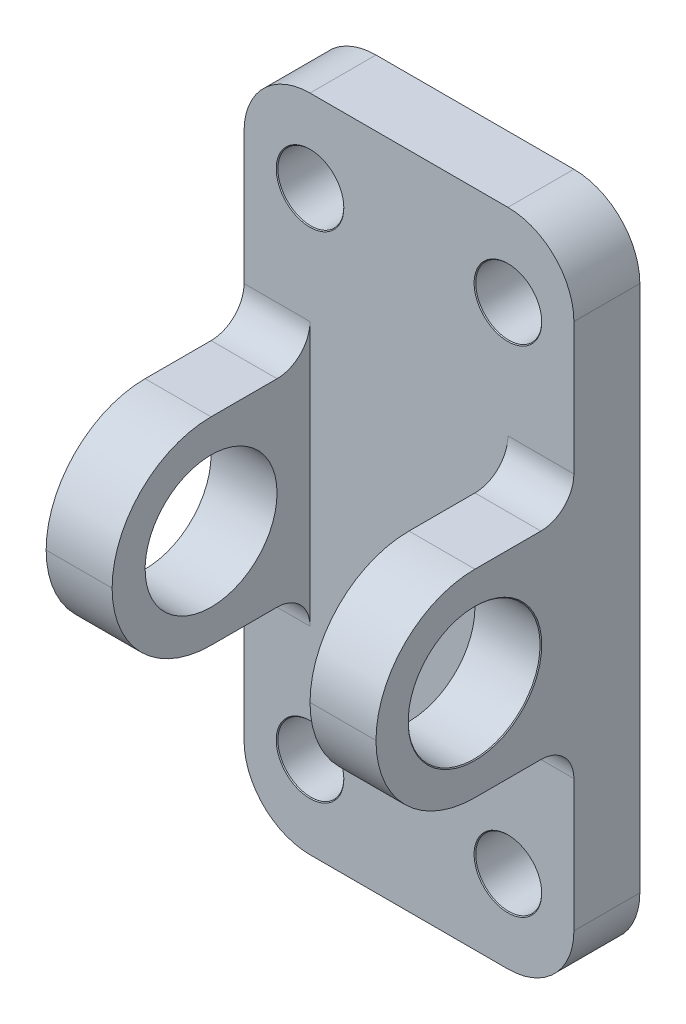
ISO-10303-21;
HEADER;
FILE_DESCRIPTION(('STEP AP214'),'2;1');
FILE_NAME('part.step','',(''),(''),'','','');
FILE_SCHEMA(('AUTOMOTIVE_DESIGN { 1 0 10303 214 1 1 1 1 }'));
ENDSEC;
DATA;
#1=APPLICATION_CONTEXT('core data for automotive mechanical design processes');
#2=APPLICATION_PROTOCOL_DEFINITION('international standard','automotive_design',2000,#1);
#3=PRODUCT_CONTEXT('',#1,'mechanical');
#4=PRODUCT('Part','Part','',(#3));
#5=PRODUCT_RELATED_PRODUCT_CATEGORY('part','',(#4));
#6=PRODUCT_DEFINITION_FORMATION('','',#4);
#7=PRODUCT_DEFINITION_CONTEXT('part definition',#1,'design');
#8=PRODUCT_DEFINITION('design','',#6,#7);
#9=PRODUCT_DEFINITION_SHAPE('','',#8);
#10=(LENGTH_UNIT() NAMED_UNIT(*) SI_UNIT(.MILLI.,.METRE.));
#11=(NAMED_UNIT(*) PLANE_ANGLE_UNIT() SI_UNIT($,.RADIAN.));
#12=(NAMED_UNIT(*) SI_UNIT($,.STERADIAN.) SOLID_ANGLE_UNIT());
#13=UNCERTAINTY_MEASURE_WITH_UNIT(LENGTH_MEASURE(1.E-05),#10,'distance_accuracy_value','');
#14=(GEOMETRIC_REPRESENTATION_CONTEXT(3) GLOBAL_UNCERTAINTY_ASSIGNED_CONTEXT((#13)) GLOBAL_UNIT_ASSIGNED_CONTEXT((#10,
#11,#12)) REPRESENTATION_CONTEXT('',''));
#15=CARTESIAN_POINT('',(0.,0.,0.));
#16=DIRECTION('',(0.,0.,1.));
#17=DIRECTION('',(1.,0.,0.));
#18=AXIS2_PLACEMENT_3D('',#15,#16,#17);
#19=CARTESIAN_POINT('',(0.,0.,0.));
#20=DIRECTION('',(0.,0.,1.));
#21=DIRECTION('',(1.,0.,0.));
#22=AXIS2_PLACEMENT_3D('',#19,#20,#21);
#23=PLANE('',#22);
#24=CARTESIAN_POINT('',(-3.,-7.5,0.));
#25=DIRECTION('',(0.,0.,1.));
#26=DIRECTION('',(1.,0.,0.));
#27=AXIS2_PLACEMENT_3D('',#24,#25,#26);
#28=CIRCLE('',#27,1.025);
#29=CARTESIAN_POINT('',(-1.975,-7.5,0.));
#30=VERTEX_POINT('',#29);
#31=EDGE_CURVE('E430',#30,#30,#28,.T.);
#32=ORIENTED_EDGE('',*,*,#31,.F.);
#33=EDGE_LOOP('',(#32));
#34=FACE_BOUND('',#33,.T.);
#35=CARTESIAN_POINT('',(3.,-7.5,0.));
#36=DIRECTION('',(0.,0.,1.));
#37=DIRECTION('',(1.,0.,0.));
#38=AXIS2_PLACEMENT_3D('',#35,#36,#37);
#39=CIRCLE('',#38,1.025);
#40=CARTESIAN_POINT('',(4.025,-7.5,0.));
#41=VERTEX_POINT('',#40);
#42=EDGE_CURVE('E417',#41,#41,#39,.T.);
#43=ORIENTED_EDGE('',*,*,#42,.F.);
#44=EDGE_LOOP('',(#43));
#45=FACE_BOUND('',#44,.T.);
#46=CARTESIAN_POINT('',(-3.,7.5,0.));
#47=DIRECTION('',(0.,0.,1.));
#48=DIRECTION('',(1.,0.,0.));
#49=AXIS2_PLACEMENT_3D('',#46,#47,#48);
#50=CIRCLE('',#49,1.025);
#51=CARTESIAN_POINT('',(-1.975,7.5,0.));
#52=VERTEX_POINT('',#51);
#53=EDGE_CURVE('E408',#52,#52,#50,.T.);
#54=ORIENTED_EDGE('',*,*,#53,.F.);
#55=EDGE_LOOP('',(#54));
#56=FACE_BOUND('',#55,.T.);
#57=CARTESIAN_POINT('',(3.,7.5,0.));
#58=DIRECTION('',(0.,0.,1.));
#59=DIRECTION('',(1.,0.,0.));
#60=AXIS2_PLACEMENT_3D('',#57,#58,#59);
#61=CIRCLE('',#60,1.025);
#62=CARTESIAN_POINT('',(4.025,7.5,0.));
#63=VERTEX_POINT('',#62);
#64=EDGE_CURVE('E399',#63,#63,#61,.T.);
#65=ORIENTED_EDGE('',*,*,#64,.F.);
#66=EDGE_LOOP('',(#65));
#67=FACE_BOUND('',#66,.T.);
#68=DIRECTION('',(-1.,0.,0.));
#69=VECTOR('',#68,1.);
#70=CARTESIAN_POINT('',(-5.,10.,0.));
#71=LINE('',#70,#69);
#72=CARTESIAN_POINT('',(3.,10.,0.));
#73=VERTEX_POINT('',#72);
#74=CARTESIAN_POINT('',(-3.,10.,0.));
#75=VERTEX_POINT('',#74);
#76=EDGE_CURVE('E355',#73,#75,#71,.T.);
#77=ORIENTED_EDGE('',*,*,#76,.T.);
#78=CARTESIAN_POINT('',(-3.,8.,0.));
#79=DIRECTION('',(0.,0.,1.));
#80=DIRECTION('',(1.,0.,0.));
#81=AXIS2_PLACEMENT_3D('',#78,#79,#80);
#82=CIRCLE('',#81,2.);
#83=CARTESIAN_POINT('',(-5.,8.,0.));
#84=VERTEX_POINT('',#83);
#85=EDGE_CURVE('E310',#75,#84,#82,.T.);
#86=ORIENTED_EDGE('',*,*,#85,.T.);
#87=DIRECTION('',(0.,-1.,0.));
#88=VECTOR('',#87,1.);
#89=CARTESIAN_POINT('',(-5.,-10.,0.));
#90=LINE('',#89,#88);
#91=CARTESIAN_POINT('',(-5.,4.,0.));
#92=VERTEX_POINT('',#91);
#93=EDGE_CURVE('E226',#84,#92,#90,.T.);
#94=ORIENTED_EDGE('',*,*,#93,.T.);
#95=DIRECTION('',(1.,0.,0.));
#96=VECTOR('',#95,1.);
#97=CARTESIAN_POINT('',(-3.,4.,0.));
#98=LINE('',#97,#96);
#99=CARTESIAN_POINT('',(-3.,4.,0.));
#100=VERTEX_POINT('',#99);
#101=EDGE_CURVE('E265',#92,#100,#98,.T.);
#102=ORIENTED_EDGE('',*,*,#101,.T.);
#103=DIRECTION('',(0.,1.,0.));
#104=VECTOR('',#103,1.);
#105=CARTESIAN_POINT('',(-3.,0.,0.));
#106=LINE('',#105,#104);
#107=CARTESIAN_POINT('',(-3.,-4.,0.));
#108=VERTEX_POINT('',#107);
#109=EDGE_CURVE('E366',#108,#100,#106,.T.);
#110=ORIENTED_EDGE('',*,*,#109,.F.);
#111=DIRECTION('',(1.,0.,0.));
#112=VECTOR('',#111,1.);
#113=CARTESIAN_POINT('',(0.,-4.,0.));
#114=LINE('',#113,#112);
#115=CARTESIAN_POINT('',(-5.,-4.,0.));
#116=VERTEX_POINT('',#115);
#117=EDGE_CURVE('E257',#108,#116,#114,.F.);
#118=ORIENTED_EDGE('',*,*,#117,.T.);
#119=CARTESIAN_POINT('',(-5.,-8.,0.));
#120=VERTEX_POINT('',#119);
#121=EDGE_CURVE('E350',#116,#120,#90,.T.);
#122=ORIENTED_EDGE('',*,*,#121,.T.);
#123=CARTESIAN_POINT('',(-3.,-8.,0.));
#124=DIRECTION('',(0.,0.,1.));
#125=DIRECTION('',(1.,0.,0.));
#126=AXIS2_PLACEMENT_3D('',#123,#124,#125);
#127=CIRCLE('',#126,2.);
#128=CARTESIAN_POINT('',(-3.,-10.,0.));
#129=VERTEX_POINT('',#128);
#130=EDGE_CURVE('E301',#120,#129,#127,.T.);
#131=ORIENTED_EDGE('',*,*,#130,.T.);
#132=DIRECTION('',(1.,0.,0.));
#133=VECTOR('',#132,1.);
#134=CARTESIAN_POINT('',(-5.,-10.,0.));
#135=LINE('',#134,#133);
#136=CARTESIAN_POINT('',(3.,-10.,0.));
#137=VERTEX_POINT('',#136);
#138=EDGE_CURVE('E332',#129,#137,#135,.T.);
#139=ORIENTED_EDGE('',*,*,#138,.T.);
#140=CARTESIAN_POINT('',(3.,-8.,0.));
#141=DIRECTION('',(0.,0.,1.));
#142=DIRECTION('',(1.,0.,0.));
#143=AXIS2_PLACEMENT_3D('',#140,#141,#142);
#144=CIRCLE('',#143,2.);
#145=CARTESIAN_POINT('',(5.,-8.,0.));
#146=VERTEX_POINT('',#145);
#147=EDGE_CURVE('E303',#137,#146,#144,.T.);
#148=ORIENTED_EDGE('',*,*,#147,.T.);
#149=DIRECTION('',(0.,1.,0.));
#150=VECTOR('',#149,1.);
#151=CARTESIAN_POINT('',(5.,-10.,0.));
#152=LINE('',#151,#150);
#153=CARTESIAN_POINT('',(5.,-4.,0.));
#154=VERTEX_POINT('',#153);
#155=EDGE_CURVE('E352',#146,#154,#152,.T.);
#156=ORIENTED_EDGE('',*,*,#155,.T.);
#157=DIRECTION('',(1.,0.,0.));
#158=VECTOR('',#157,1.);
#159=CARTESIAN_POINT('',(0.,-4.,0.));
#160=LINE('',#159,#158);
#161=CARTESIAN_POINT('',(3.,-4.,0.));
#162=VERTEX_POINT('',#161);
#163=EDGE_CURVE('E250',#154,#162,#160,.F.);
#164=ORIENTED_EDGE('',*,*,#163,.T.);
#165=DIRECTION('',(0.,1.,0.));
#166=VECTOR('',#165,1.);
#167=CARTESIAN_POINT('',(3.,0.,0.));
#168=LINE('',#167,#166);
#169=CARTESIAN_POINT('',(3.,4.,0.));
#170=VERTEX_POINT('',#169);
#171=EDGE_CURVE('E218',#162,#170,#168,.T.);
#172=ORIENTED_EDGE('',*,*,#171,.T.);
#173=DIRECTION('',(1.,0.,0.));
#174=VECTOR('',#173,1.);
#175=CARTESIAN_POINT('',(5.,4.,0.));
#176=LINE('',#175,#174);
#177=CARTESIAN_POINT('',(5.,4.,0.));
#178=VERTEX_POINT('',#177);
#179=EDGE_CURVE('E264',#170,#178,#176,.T.);
#180=ORIENTED_EDGE('',*,*,#179,.T.);
#181=CARTESIAN_POINT('',(5.,8.,0.));
#182=VERTEX_POINT('',#181);
#183=EDGE_CURVE('E354',#178,#182,#152,.T.);
#184=ORIENTED_EDGE('',*,*,#183,.T.);
#185=CARTESIAN_POINT('',(3.,8.,0.));
#186=DIRECTION('',(0.,0.,1.));
#187=DIRECTION('',(1.,0.,0.));
#188=AXIS2_PLACEMENT_3D('',#185,#186,#187);
#189=CIRCLE('',#188,2.);
#190=EDGE_CURVE('E304',#182,#73,#189,.T.);
#191=ORIENTED_EDGE('',*,*,#190,.T.);
#192=EDGE_LOOP('',(#77,#86,#94,#102,#110,#118,#122,#131,#139,#148,#156,#164,#172,#180,#184,#191));
#193=FACE_BOUND('',#192,.T.);
#194=ADVANCED_FACE('F41',(#34,#45,#56,#67,#193),#23,.T.);
#195=CARTESIAN_POINT('',(-5.,-10.,-2.));
#196=DIRECTION('',(0.,-1.,0.));
#197=DIRECTION('',(0.,0.,-1.));
#198=AXIS2_PLACEMENT_3D('',#195,#196,#197);
#199=PLANE('',#198);
#200=DIRECTION('',(1.,0.,0.));
#201=VECTOR('',#200,1.);
#202=CARTESIAN_POINT('',(-5.,-10.,-2.));
#203=LINE('',#202,#201);
#204=CARTESIAN_POINT('',(-3.,-10.,-2.));
#205=VERTEX_POINT('',#204);
#206=CARTESIAN_POINT('',(3.,-10.,-2.));
#207=VERTEX_POINT('',#206);
#208=EDGE_CURVE('E329',#205,#207,#203,.T.);
#209=ORIENTED_EDGE('',*,*,#208,.T.);
#210=DIRECTION('',(0.,0.,1.));
#211=VECTOR('',#210,1.);
#212=CARTESIAN_POINT('',(3.,-10.,-2.));
#213=LINE('',#212,#211);
#214=EDGE_CURVE('E11',#207,#137,#213,.T.);
#215=ORIENTED_EDGE('',*,*,#214,.T.);
#216=ORIENTED_EDGE('',*,*,#138,.F.);
#217=DIRECTION('',(0.,0.,1.));
#218=VECTOR('',#217,1.);
#219=CARTESIAN_POINT('',(-3.,-10.,-2.));
#220=LINE('',#219,#218);
#221=EDGE_CURVE('E47',#129,#205,#220,.F.);
#222=ORIENTED_EDGE('',*,*,#221,.T.);
#223=EDGE_LOOP('',(#209,#215,#216,#222));
#224=FACE_BOUND('',#223,.T.);
#225=ADVANCED_FACE('F327',(#224),#199,.T.);
#226=CARTESIAN_POINT('',(-5.,-10.,-2.));
#227=DIRECTION('',(-1.,0.,0.));
#228=DIRECTION('',(0.,-1.,0.));
#229=AXIS2_PLACEMENT_3D('',#226,#227,#228);
#230=PLANE('',#229);
#231=CARTESIAN_POINT('',(-5.,0.,3.));
#232=DIRECTION('',(1.,0.,0.));
#233=DIRECTION('',(0.,0.,-1.));
#234=AXIS2_PLACEMENT_3D('',#231,#232,#233);
#235=CIRCLE('',#234,2.);
#236=CARTESIAN_POINT('',(-5.,0.,1.));
#237=VERTEX_POINT('',#236);
#238=EDGE_CURVE('E256',#237,#237,#235,.T.);
#239=ORIENTED_EDGE('',*,*,#238,.T.);
#240=EDGE_LOOP('',(#239));
#241=FACE_BOUND('',#240,.T.);
#242=ORIENTED_EDGE('',*,*,#93,.F.);
#243=DIRECTION('',(0.,0.,1.));
#244=VECTOR('',#243,1.);
#245=CARTESIAN_POINT('',(-5.,8.,-2.));
#246=LINE('',#245,#244);
#247=CARTESIAN_POINT('',(-5.,8.,-2.));
#248=VERTEX_POINT('',#247);
#249=EDGE_CURVE('E315',#84,#248,#246,.F.);
#250=ORIENTED_EDGE('',*,*,#249,.T.);
#251=DIRECTION('',(0.,-1.,0.));
#252=VECTOR('',#251,1.);
#253=CARTESIAN_POINT('',(-5.,-10.,-2.));
#254=LINE('',#253,#252);
#255=CARTESIAN_POINT('',(-5.,-8.,-2.));
#256=VERTEX_POINT('',#255);
#257=EDGE_CURVE('E221',#248,#256,#254,.T.);
#258=ORIENTED_EDGE('',*,*,#257,.T.);
#259=DIRECTION('',(0.,0.,1.));
#260=VECTOR('',#259,1.);
#261=CARTESIAN_POINT('',(-5.,-8.,-2.));
#262=LINE('',#261,#260);
#263=EDGE_CURVE('E307',#256,#120,#262,.T.);
#264=ORIENTED_EDGE('',*,*,#263,.T.);
#265=ORIENTED_EDGE('',*,*,#121,.F.);
#266=CARTESIAN_POINT('',(-5.,-4.,1.));
#267=DIRECTION('',(-1.,0.,0.));
#268=DIRECTION('',(0.,-1.,0.));
#269=AXIS2_PLACEMENT_3D('',#266,#267,#268);
#270=CIRCLE('',#269,1.);
#271=CARTESIAN_POINT('',(-5.,-3.,1.));
#272=VERTEX_POINT('',#271);
#273=EDGE_CURVE('E288',#116,#272,#270,.F.);
#274=ORIENTED_EDGE('',*,*,#273,.T.);
#275=DIRECTION('',(0.,0.,-1.));
#276=VECTOR('',#275,1.);
#277=CARTESIAN_POINT('',(-5.,-3.,6.));
#278=LINE('',#277,#276);
#279=CARTESIAN_POINT('',(-5.,-3.,3.));
#280=VERTEX_POINT('',#279);
#281=EDGE_CURVE('E379',#280,#272,#278,.T.);
#282=ORIENTED_EDGE('',*,*,#281,.F.);
#283=CARTESIAN_POINT('',(-5.,0.,3.));
#284=DIRECTION('',(-1.,0.,0.));
#285=DIRECTION('',(0.,-1.,0.));
#286=AXIS2_PLACEMENT_3D('',#283,#284,#285);
#287=CIRCLE('',#286,3.);
#288=CARTESIAN_POINT('',(-5.,0.,6.));
#289=VERTEX_POINT('',#288);
#290=EDGE_CURVE('E241',#280,#289,#287,.T.);
#291=ORIENTED_EDGE('',*,*,#290,.T.);
#292=CARTESIAN_POINT('',(-5.,0.,3.));
#293=DIRECTION('',(-1.,0.,0.));
#294=DIRECTION('',(0.,-1.,0.));
#295=AXIS2_PLACEMENT_3D('',#292,#293,#294);
#296=CIRCLE('',#295,3.);
#297=CARTESIAN_POINT('',(-5.,3.,3.));
#298=VERTEX_POINT('',#297);
#299=EDGE_CURVE('E243',#289,#298,#296,.T.);
#300=ORIENTED_EDGE('',*,*,#299,.T.);
#301=DIRECTION('',(0.,0.,-1.));
#302=VECTOR('',#301,1.);
#303=CARTESIAN_POINT('',(-5.,3.,6.));
#304=LINE('',#303,#302);
#305=CARTESIAN_POINT('',(-5.,3.,1.));
#306=VERTEX_POINT('',#305);
#307=EDGE_CURVE('E380',#298,#306,#304,.T.);
#308=ORIENTED_EDGE('',*,*,#307,.T.);
#309=CARTESIAN_POINT('',(-5.,4.,1.));
#310=DIRECTION('',(-1.,0.,0.));
#311=DIRECTION('',(0.,-1.,0.));
#312=AXIS2_PLACEMENT_3D('',#309,#310,#311);
#313=CIRCLE('',#312,1.);
#314=EDGE_CURVE('E281',#306,#92,#313,.F.);
#315=ORIENTED_EDGE('',*,*,#314,.T.);
#316=EDGE_LOOP('',(#242,#250,#258,#264,#265,#274,#282,#291,#300,#308,#315));
#317=FACE_BOUND('',#316,.T.);
#318=ADVANCED_FACE('F348',(#241,#317),#230,.T.);
#319=CARTESIAN_POINT('',(-5.,10.,-2.));
#320=DIRECTION('',(0.,1.,0.));
#321=DIRECTION('',(0.,0.,1.));
#322=AXIS2_PLACEMENT_3D('',#319,#320,#321);
#323=PLANE('',#322);
#324=DIRECTION('',(-1.,0.,0.));
#325=VECTOR('',#324,1.);
#326=CARTESIAN_POINT('',(-5.,10.,-2.));
#327=LINE('',#326,#325);
#328=CARTESIAN_POINT('',(3.,10.,-2.));
#329=VERTEX_POINT('',#328);
#330=CARTESIAN_POINT('',(-3.,10.,-2.));
#331=VERTEX_POINT('',#330);
#332=EDGE_CURVE('E224',#329,#331,#327,.T.);
#333=ORIENTED_EDGE('',*,*,#332,.T.);
#334=DIRECTION('',(0.,0.,1.));
#335=VECTOR('',#334,1.);
#336=CARTESIAN_POINT('',(-3.,10.,-2.));
#337=LINE('',#336,#335);
#338=EDGE_CURVE('E296',#331,#75,#337,.T.);
#339=ORIENTED_EDGE('',*,*,#338,.T.);
#340=ORIENTED_EDGE('',*,*,#76,.F.);
#341=DIRECTION('',(0.,0.,1.));
#342=VECTOR('',#341,1.);
#343=CARTESIAN_POINT('',(3.,10.,-2.));
#344=LINE('',#343,#342);
#345=EDGE_CURVE('E298',#73,#329,#344,.F.);
#346=ORIENTED_EDGE('',*,*,#345,.T.);
#347=EDGE_LOOP('',(#333,#339,#340,#346));
#348=FACE_BOUND('',#347,.T.);
#349=ADVANCED_FACE('F500',(#348),#323,.T.);
#350=CARTESIAN_POINT('',(5.,-10.,-2.));
#351=DIRECTION('',(1.,0.,0.));
#352=DIRECTION('',(0.,1.,0.));
#353=AXIS2_PLACEMENT_3D('',#350,#351,#352);
#354=PLANE('',#353);
#355=CARTESIAN_POINT('',(5.,0.,3.));
#356=DIRECTION('',(1.,0.,0.));
#357=DIRECTION('',(0.,0.,-1.));
#358=AXIS2_PLACEMENT_3D('',#355,#356,#357);
#359=CIRCLE('',#358,2.025);
#360=CARTESIAN_POINT('',(5.,0.,0.975));
#361=VERTEX_POINT('',#360);
#362=EDGE_CURVE('E393',#361,#361,#359,.T.);
#363=ORIENTED_EDGE('',*,*,#362,.F.);
#364=EDGE_LOOP('',(#363));
#365=FACE_BOUND('',#364,.T.);
#366=DIRECTION('',(0.,1.,0.));
#367=VECTOR('',#366,1.);
#368=CARTESIAN_POINT('',(5.,-10.,-2.));
#369=LINE('',#368,#367);
#370=CARTESIAN_POINT('',(5.,-8.,-2.));
#371=VERTEX_POINT('',#370);
#372=CARTESIAN_POINT('',(5.,8.,-2.));
#373=VERTEX_POINT('',#372);
#374=EDGE_CURVE('E339',#371,#373,#369,.T.);
#375=ORIENTED_EDGE('',*,*,#374,.T.);
#376=DIRECTION('',(0.,0.,1.));
#377=VECTOR('',#376,1.);
#378=CARTESIAN_POINT('',(5.,8.,-2.));
#379=LINE('',#378,#377);
#380=EDGE_CURVE('E321',#373,#182,#379,.T.);
#381=ORIENTED_EDGE('',*,*,#380,.T.);
#382=ORIENTED_EDGE('',*,*,#183,.F.);
#383=CARTESIAN_POINT('',(5.,4.,1.));
#384=DIRECTION('',(1.,0.,0.));
#385=DIRECTION('',(0.,1.,0.));
#386=AXIS2_PLACEMENT_3D('',#383,#384,#385);
#387=CIRCLE('',#386,1.);
#388=CARTESIAN_POINT('',(4.99999999999999,3.,1.));
#389=VERTEX_POINT('',#388);
#390=EDGE_CURVE('E276',#178,#389,#387,.F.);
#391=ORIENTED_EDGE('',*,*,#390,.T.);
#392=DIRECTION('',(0.,0.,-1.));
#393=VECTOR('',#392,1.);
#394=CARTESIAN_POINT('',(4.99999999999999,3.,6.));
#395=LINE('',#394,#393);
#396=CARTESIAN_POINT('',(4.99999999999999,3.,3.));
#397=VERTEX_POINT('',#396);
#398=EDGE_CURVE('E212',#397,#389,#395,.T.);
#399=ORIENTED_EDGE('',*,*,#398,.F.);
#400=CARTESIAN_POINT('',(5.,0.,3.));
#401=DIRECTION('',(1.,0.,0.));
#402=DIRECTION('',(0.,1.,0.));
#403=AXIS2_PLACEMENT_3D('',#400,#401,#402);
#404=CIRCLE('',#403,3.);
#405=CARTESIAN_POINT('',(5.,0.,6.));
#406=VERTEX_POINT('',#405);
#407=EDGE_CURVE('E217',#397,#406,#404,.T.);
#408=ORIENTED_EDGE('',*,*,#407,.T.);
#409=CARTESIAN_POINT('',(5.,0.,3.));
#410=DIRECTION('',(1.,0.,0.));
#411=DIRECTION('',(0.,1.,0.));
#412=AXIS2_PLACEMENT_3D('',#409,#410,#411);
#413=CIRCLE('',#412,3.);
#414=CARTESIAN_POINT('',(5.,-3.,3.));
#415=VERTEX_POINT('',#414);
#416=EDGE_CURVE('E219',#406,#415,#413,.T.);
#417=ORIENTED_EDGE('',*,*,#416,.T.);
#418=DIRECTION('',(0.,0.,-1.));
#419=VECTOR('',#418,1.);
#420=CARTESIAN_POINT('',(5.,-3.,6.));
#421=LINE('',#420,#419);
#422=CARTESIAN_POINT('',(5.,-3.,1.));
#423=VERTEX_POINT('',#422);
#424=EDGE_CURVE('E370',#415,#423,#421,.T.);
#425=ORIENTED_EDGE('',*,*,#424,.T.);
#426=CARTESIAN_POINT('',(5.,-4.,1.));
#427=DIRECTION('',(1.,0.,0.));
#428=DIRECTION('',(0.,1.,0.));
#429=AXIS2_PLACEMENT_3D('',#426,#427,#428);
#430=CIRCLE('',#429,1.);
#431=EDGE_CURVE('E293',#423,#154,#430,.F.);
#432=ORIENTED_EDGE('',*,*,#431,.T.);
#433=ORIENTED_EDGE('',*,*,#155,.F.);
#434=DIRECTION('',(0.,0.,1.));
#435=VECTOR('',#434,1.);
#436=CARTESIAN_POINT('',(5.,-8.,-2.));
#437=LINE('',#436,#435);
#438=EDGE_CURVE('E65',#146,#371,#437,.F.);
#439=ORIENTED_EDGE('',*,*,#438,.T.);
#440=EDGE_LOOP('',(#375,#381,#382,#391,#399,#408,#417,#425,#432,#433,#439));
#441=FACE_BOUND('',#440,.T.);
#442=ADVANCED_FACE('F495',(#365,#441),#354,.T.);
#443=CARTESIAN_POINT('',(0.,0.,-2.));
#444=DIRECTION('',(0.,0.,1.));
#445=DIRECTION('',(1.,0.,0.));
#446=AXIS2_PLACEMENT_3D('',#443,#444,#445);
#447=PLANE('',#446);
#448=CARTESIAN_POINT('',(-3.,-7.5,-2.));
#449=DIRECTION('',(0.,0.,1.));
#450=DIRECTION('',(1.,0.,0.));
#451=AXIS2_PLACEMENT_3D('',#448,#449,#450);
#452=CIRCLE('',#451,1.);
#453=CARTESIAN_POINT('',(-2.,-7.5,-2.));
#454=VERTEX_POINT('',#453);
#455=EDGE_CURVE('E423',#454,#454,#452,.T.);
#456=ORIENTED_EDGE('',*,*,#455,.T.);
#457=EDGE_LOOP('',(#456));
#458=FACE_BOUND('',#457,.T.);
#459=CARTESIAN_POINT('',(3.,-7.5,-2.));
#460=DIRECTION('',(0.,0.,1.));
#461=DIRECTION('',(1.,0.,0.));
#462=AXIS2_PLACEMENT_3D('',#459,#460,#461);
#463=CIRCLE('',#462,1.);
#464=CARTESIAN_POINT('',(4.,-7.5,-2.));
#465=VERTEX_POINT('',#464);
#466=EDGE_CURVE('E415',#465,#465,#463,.T.);
#467=ORIENTED_EDGE('',*,*,#466,.T.);
#468=EDGE_LOOP('',(#467));
#469=FACE_BOUND('',#468,.T.);
#470=CARTESIAN_POINT('',(-3.,7.5,-2.));
#471=DIRECTION('',(0.,0.,1.));
#472=DIRECTION('',(1.,0.,0.));
#473=AXIS2_PLACEMENT_3D('',#470,#471,#472);
#474=CIRCLE('',#473,1.);
#475=CARTESIAN_POINT('',(-2.,7.5,-2.));
#476=VERTEX_POINT('',#475);
#477=EDGE_CURVE('E401',#476,#476,#474,.T.);
#478=ORIENTED_EDGE('',*,*,#477,.T.);
#479=EDGE_LOOP('',(#478));
#480=FACE_BOUND('',#479,.T.);
#481=CARTESIAN_POINT('',(3.,7.5,-2.));
#482=DIRECTION('',(0.,0.,1.));
#483=DIRECTION('',(1.,0.,0.));
#484=AXIS2_PLACEMENT_3D('',#481,#482,#483);
#485=CIRCLE('',#484,1.);
#486=CARTESIAN_POINT('',(4.,7.5,-2.));
#487=VERTEX_POINT('',#486);
#488=EDGE_CURVE('E392',#487,#487,#485,.T.);
#489=ORIENTED_EDGE('',*,*,#488,.T.);
#490=EDGE_LOOP('',(#489));
#491=FACE_BOUND('',#490,.T.);
#492=ORIENTED_EDGE('',*,*,#257,.F.);
#493=CARTESIAN_POINT('',(-3.,8.,-2.));
#494=DIRECTION('',(0.,0.,1.));
#495=DIRECTION('',(1.,0.,0.));
#496=AXIS2_PLACEMENT_3D('',#493,#494,#495);
#497=CIRCLE('',#496,2.);
#498=EDGE_CURVE('E316',#248,#331,#497,.F.);
#499=ORIENTED_EDGE('',*,*,#498,.T.);
#500=ORIENTED_EDGE('',*,*,#332,.F.);
#501=CARTESIAN_POINT('',(3.,8.,-2.));
#502=DIRECTION('',(0.,0.,1.));
#503=DIRECTION('',(1.,0.,0.));
#504=AXIS2_PLACEMENT_3D('',#501,#502,#503);
#505=CIRCLE('',#504,2.);
#506=EDGE_CURVE('E57',#329,#373,#505,.F.);
#507=ORIENTED_EDGE('',*,*,#506,.T.);
#508=ORIENTED_EDGE('',*,*,#374,.F.);
#509=CARTESIAN_POINT('',(3.,-8.,-2.));
#510=DIRECTION('',(0.,0.,1.));
#511=DIRECTION('',(1.,0.,0.));
#512=AXIS2_PLACEMENT_3D('',#509,#510,#511);
#513=CIRCLE('',#512,2.);
#514=EDGE_CURVE('E317',#371,#207,#513,.F.);
#515=ORIENTED_EDGE('',*,*,#514,.T.);
#516=ORIENTED_EDGE('',*,*,#208,.F.);
#517=CARTESIAN_POINT('',(-3.,-8.,-2.));
#518=DIRECTION('',(0.,0.,1.));
#519=DIRECTION('',(1.,0.,0.));
#520=AXIS2_PLACEMENT_3D('',#517,#518,#519);
#521=CIRCLE('',#520,2.);
#522=EDGE_CURVE('E313',#205,#256,#521,.F.);
#523=ORIENTED_EDGE('',*,*,#522,.T.);
#524=EDGE_LOOP('',(#492,#499,#500,#507,#508,#515,#516,#523));
#525=FACE_BOUND('',#524,.T.);
#526=ADVANCED_FACE('F340',(#458,#469,#480,#491,#525),#447,.F.);
#527=CARTESIAN_POINT('',(3.,0.,6.));
#528=DIRECTION('',(-1.,0.,0.));
#529=DIRECTION('',(0.,-1.,0.));
#530=AXIS2_PLACEMENT_3D('',#527,#528,#529);
#531=PLANE('',#530);
#532=CARTESIAN_POINT('',(3.,0.,3.));
#533=DIRECTION('',(-1.,0.,0.));
#534=DIRECTION('',(0.,-1.,0.));
#535=AXIS2_PLACEMENT_3D('',#532,#533,#534);
#536=CIRCLE('',#535,2.);
#537=CARTESIAN_POINT('',(3.,-1.99999999999999,3.));
#538=VERTEX_POINT('',#537);
#539=EDGE_CURVE('E254',#538,#538,#536,.T.);
#540=ORIENTED_EDGE('',*,*,#539,.F.);
#541=EDGE_LOOP('',(#540));
#542=FACE_BOUND('',#541,.T.);
#543=CARTESIAN_POINT('',(3.,0.,3.));
#544=DIRECTION('',(-1.,0.,0.));
#545=DIRECTION('',(0.,-1.,0.));
#546=AXIS2_PLACEMENT_3D('',#543,#544,#545);
#547=CIRCLE('',#546,3.);
#548=CARTESIAN_POINT('',(3.,-3.,3.));
#549=VERTEX_POINT('',#548);
#550=CARTESIAN_POINT('',(3.,0.,6.));
#551=VERTEX_POINT('',#550);
#552=EDGE_CURVE('E199',#549,#551,#547,.T.);
#553=ORIENTED_EDGE('',*,*,#552,.T.);
#554=CARTESIAN_POINT('',(3.,0.,3.));
#555=DIRECTION('',(-1.,0.,0.));
#556=DIRECTION('',(0.,-1.,0.));
#557=AXIS2_PLACEMENT_3D('',#554,#555,#556);
#558=CIRCLE('',#557,3.);
#559=CARTESIAN_POINT('',(3.,3.,3.));
#560=VERTEX_POINT('',#559);
#561=EDGE_CURVE('E191',#551,#560,#558,.T.);
#562=ORIENTED_EDGE('',*,*,#561,.T.);
#563=DIRECTION('',(0.,0.,-1.));
#564=VECTOR('',#563,1.);
#565=CARTESIAN_POINT('',(3.,3.,6.));
#566=LINE('',#565,#564);
#567=CARTESIAN_POINT('',(3.,3.,1.));
#568=VERTEX_POINT('',#567);
#569=EDGE_CURVE('E198',#560,#568,#566,.T.);
#570=ORIENTED_EDGE('',*,*,#569,.T.);
#571=CARTESIAN_POINT('',(3.,4.,1.));
#572=DIRECTION('',(-1.,0.,0.));
#573=DIRECTION('',(0.,-1.,0.));
#574=AXIS2_PLACEMENT_3D('',#571,#572,#573);
#575=CIRCLE('',#574,1.);
#576=EDGE_CURVE('E278',#568,#170,#575,.F.);
#577=ORIENTED_EDGE('',*,*,#576,.T.);
#578=ORIENTED_EDGE('',*,*,#171,.F.);
#579=CARTESIAN_POINT('',(3.,-4.,1.));
#580=DIRECTION('',(-1.,0.,0.));
#581=DIRECTION('',(0.,-1.,0.));
#582=AXIS2_PLACEMENT_3D('',#579,#580,#581);
#583=CIRCLE('',#582,1.);
#584=CARTESIAN_POINT('',(3.,-3.,1.));
#585=VERTEX_POINT('',#584);
#586=EDGE_CURVE('E295',#162,#585,#583,.F.);
#587=ORIENTED_EDGE('',*,*,#586,.T.);
#588=DIRECTION('',(0.,0.,-1.));
#589=VECTOR('',#588,1.);
#590=CARTESIAN_POINT('',(3.,-3.,6.));
#591=LINE('',#590,#589);
#592=EDGE_CURVE('E361',#549,#585,#591,.T.);
#593=ORIENTED_EDGE('',*,*,#592,.F.);
#594=EDGE_LOOP('',(#553,#562,#570,#577,#578,#587,#593));
#595=FACE_BOUND('',#594,.T.);
#596=ADVANCED_FACE('F193',(#542,#595),#531,.T.);
#597=CARTESIAN_POINT('',(0.,-3.,6.));
#598=DIRECTION('',(0.,1.,0.));
#599=DIRECTION('',(-1.,0.,0.));
#600=AXIS2_PLACEMENT_3D('',#597,#598,#599);
#601=PLANE('',#600);
#602=ORIENTED_EDGE('',*,*,#592,.T.);
#603=DIRECTION('',(1.,0.,0.));
#604=VECTOR('',#603,1.);
#605=CARTESIAN_POINT('',(0.,-3.,1.));
#606=LINE('',#605,#604);
#607=EDGE_CURVE('E274',#585,#423,#606,.T.);
#608=ORIENTED_EDGE('',*,*,#607,.T.);
#609=ORIENTED_EDGE('',*,*,#424,.F.);
#610=DIRECTION('',(1.,0.,0.));
#611=VECTOR('',#610,1.);
#612=CARTESIAN_POINT('',(3.,-3.,3.));
#613=LINE('',#612,#611);
#614=EDGE_CURVE('E204',#415,#549,#613,.F.);
#615=ORIENTED_EDGE('',*,*,#614,.T.);
#616=EDGE_LOOP('',(#602,#608,#609,#615));
#617=FACE_BOUND('',#616,.T.);
#618=ADVANCED_FACE('F483',(#617),#601,.F.);
#619=CARTESIAN_POINT('',(0.,3.,6.));
#620=DIRECTION('',(0.,1.,0.));
#621=DIRECTION('',(-1.,0.,0.));
#622=AXIS2_PLACEMENT_3D('',#619,#620,#621);
#623=PLANE('',#622);
#624=ORIENTED_EDGE('',*,*,#398,.T.);
#625=DIRECTION('',(1.,0.,0.));
#626=VECTOR('',#625,1.);
#627=CARTESIAN_POINT('',(3.,3.,1.));
#628=LINE('',#627,#626);
#629=EDGE_CURVE('E213',#389,#568,#628,.F.);
#630=ORIENTED_EDGE('',*,*,#629,.T.);
#631=ORIENTED_EDGE('',*,*,#569,.F.);
#632=DIRECTION('',(1.,0.,0.));
#633=VECTOR('',#632,1.);
#634=CARTESIAN_POINT('',(0.,3.,3.));
#635=LINE('',#634,#633);
#636=EDGE_CURVE('E214',#560,#397,#635,.T.);
#637=ORIENTED_EDGE('',*,*,#636,.T.);
#638=EDGE_LOOP('',(#624,#630,#631,#637));
#639=FACE_BOUND('',#638,.T.);
#640=ADVANCED_FACE('F208',(#639),#623,.T.);
#641=CARTESIAN_POINT('',(0.,-3.,6.));
#642=DIRECTION('',(0.,1.,0.));
#643=DIRECTION('',(-1.,0.,0.));
#644=AXIS2_PLACEMENT_3D('',#641,#642,#643);
#645=PLANE('',#644);
#646=ORIENTED_EDGE('',*,*,#281,.T.);
#647=DIRECTION('',(1.,0.,0.));
#648=VECTOR('',#647,1.);
#649=CARTESIAN_POINT('',(0.,-3.,1.));
#650=LINE('',#649,#648);
#651=CARTESIAN_POINT('',(-3.,-3.,1.));
#652=VERTEX_POINT('',#651);
#653=EDGE_CURVE('E272',#272,#652,#650,.T.);
#654=ORIENTED_EDGE('',*,*,#653,.T.);
#655=DIRECTION('',(0.,0.,-1.));
#656=VECTOR('',#655,1.);
#657=CARTESIAN_POINT('',(-3.,-3.,6.));
#658=LINE('',#657,#656);
#659=CARTESIAN_POINT('',(-3.,-3.,3.));
#660=VERTEX_POINT('',#659);
#661=EDGE_CURVE('E356',#660,#652,#658,.T.);
#662=ORIENTED_EDGE('',*,*,#661,.F.);
#663=DIRECTION('',(1.,0.,0.));
#664=VECTOR('',#663,1.);
#665=CARTESIAN_POINT('',(-5.,-3.,3.));
#666=LINE('',#665,#664);
#667=EDGE_CURVE('E244',#660,#280,#666,.F.);
#668=ORIENTED_EDGE('',*,*,#667,.T.);
#669=EDGE_LOOP('',(#646,#654,#662,#668));
#670=FACE_BOUND('',#669,.T.);
#671=ADVANCED_FACE('F480',(#670),#645,.F.);
#672=CARTESIAN_POINT('',(-3.,0.,6.));
#673=DIRECTION('',(-1.,0.,0.));
#674=DIRECTION('',(0.,-1.,0.));
#675=AXIS2_PLACEMENT_3D('',#672,#673,#674);
#676=PLANE('',#675);
#677=CARTESIAN_POINT('',(-3.,0.,3.));
#678=DIRECTION('',(-1.,0.,0.));
#679=DIRECTION('',(0.,-1.,0.));
#680=AXIS2_PLACEMENT_3D('',#677,#678,#679);
#681=CIRCLE('',#680,2.);
#682=CARTESIAN_POINT('',(-3.,-1.99999999999999,3.));
#683=VERTEX_POINT('',#682);
#684=EDGE_CURVE('E251',#683,#683,#681,.T.);
#685=ORIENTED_EDGE('',*,*,#684,.T.);
#686=EDGE_LOOP('',(#685));
#687=FACE_BOUND('',#686,.T.);
#688=DIRECTION('',(0.,0.,-1.));
#689=VECTOR('',#688,1.);
#690=CARTESIAN_POINT('',(-3.,3.,6.));
#691=LINE('',#690,#689);
#692=CARTESIAN_POINT('',(-3.,3.,3.));
#693=VERTEX_POINT('',#692);
#694=CARTESIAN_POINT('',(-3.,3.,1.));
#695=VERTEX_POINT('',#694);
#696=EDGE_CURVE('E372',#693,#695,#691,.T.);
#697=ORIENTED_EDGE('',*,*,#696,.F.);
#698=CARTESIAN_POINT('',(-3.,0.,3.));
#699=DIRECTION('',(-1.,0.,0.));
#700=DIRECTION('',(0.,-1.,0.));
#701=AXIS2_PLACEMENT_3D('',#698,#699,#700);
#702=CIRCLE('',#701,3.);
#703=CARTESIAN_POINT('',(-3.,0.,6.));
#704=VERTEX_POINT('',#703);
#705=EDGE_CURVE('E237',#693,#704,#702,.F.);
#706=ORIENTED_EDGE('',*,*,#705,.T.);
#707=CARTESIAN_POINT('',(-3.,0.,3.));
#708=DIRECTION('',(-1.,0.,0.));
#709=DIRECTION('',(0.,-1.,0.));
#710=AXIS2_PLACEMENT_3D('',#707,#708,#709);
#711=CIRCLE('',#710,3.);
#712=EDGE_CURVE('E240',#704,#660,#711,.F.);
#713=ORIENTED_EDGE('',*,*,#712,.T.);
#714=ORIENTED_EDGE('',*,*,#661,.T.);
#715=CARTESIAN_POINT('',(-3.,-4.,1.));
#716=DIRECTION('',(-1.,0.,0.));
#717=DIRECTION('',(0.,-1.,0.));
#718=AXIS2_PLACEMENT_3D('',#715,#716,#717);
#719=CIRCLE('',#718,1.);
#720=EDGE_CURVE('E286',#652,#108,#719,.T.);
#721=ORIENTED_EDGE('',*,*,#720,.T.);
#722=ORIENTED_EDGE('',*,*,#109,.T.);
#723=CARTESIAN_POINT('',(-3.,4.,1.));
#724=DIRECTION('',(-1.,0.,0.));
#725=DIRECTION('',(0.,-1.,0.));
#726=AXIS2_PLACEMENT_3D('',#723,#724,#725);
#727=CIRCLE('',#726,1.);
#728=EDGE_CURVE('E283',#100,#695,#727,.T.);
#729=ORIENTED_EDGE('',*,*,#728,.T.);
#730=EDGE_LOOP('',(#697,#706,#713,#714,#721,#722,#729));
#731=FACE_BOUND('',#730,.T.);
#732=ADVANCED_FACE('F475',(#687,#731),#676,.F.);
#733=CARTESIAN_POINT('',(0.,3.,6.));
#734=DIRECTION('',(0.,1.,0.));
#735=DIRECTION('',(-1.,0.,0.));
#736=AXIS2_PLACEMENT_3D('',#733,#734,#735);
#737=PLANE('',#736);
#738=ORIENTED_EDGE('',*,*,#696,.T.);
#739=DIRECTION('',(1.,0.,0.));
#740=VECTOR('',#739,1.);
#741=CARTESIAN_POINT('',(-5.,3.,1.));
#742=LINE('',#741,#740);
#743=EDGE_CURVE('E268',#695,#306,#742,.F.);
#744=ORIENTED_EDGE('',*,*,#743,.T.);
#745=ORIENTED_EDGE('',*,*,#307,.F.);
#746=DIRECTION('',(1.,0.,0.));
#747=VECTOR('',#746,1.);
#748=CARTESIAN_POINT('',(0.,3.,3.));
#749=LINE('',#748,#747);
#750=EDGE_CURVE('E234',#298,#693,#749,.T.);
#751=ORIENTED_EDGE('',*,*,#750,.T.);
#752=EDGE_LOOP('',(#738,#744,#745,#751));
#753=FACE_BOUND('',#752,.T.);
#754=ADVANCED_FACE('F469',(#753),#737,.T.);
#755=CARTESIAN_POINT('',(0.,0.,3.));
#756=DIRECTION('',(-1.,0.,0.));
#757=DIRECTION('',(0.,-1.,0.));
#758=AXIS2_PLACEMENT_3D('',#755,#756,#757);
#759=CYLINDRICAL_SURFACE('',#758,3.);
#760=DIRECTION('',(1.,0.,0.));
#761=VECTOR('',#760,1.);
#762=CARTESIAN_POINT('',(5.,0.,6.));
#763=LINE('',#762,#761);
#764=EDGE_CURVE('E247',#551,#406,#763,.T.);
#765=ORIENTED_EDGE('',*,*,#764,.F.);
#766=ORIENTED_EDGE('',*,*,#552,.F.);
#767=ORIENTED_EDGE('',*,*,#614,.F.);
#768=ORIENTED_EDGE('',*,*,#416,.F.);
#769=EDGE_LOOP('',(#765,#766,#767,#768));
#770=FACE_BOUND('',#769,.T.);
#771=ADVANCED_FACE('F471',(#770),#759,.T.);
#772=CARTESIAN_POINT('',(0.,0.,3.));
#773=DIRECTION('',(1.,0.,0.));
#774=DIRECTION('',(0.,1.,0.));
#775=AXIS2_PLACEMENT_3D('',#772,#773,#774);
#776=CYLINDRICAL_SURFACE('',#775,3.);
#777=ORIENTED_EDGE('',*,*,#561,.F.);
#778=ORIENTED_EDGE('',*,*,#764,.T.);
#779=ORIENTED_EDGE('',*,*,#407,.F.);
#780=ORIENTED_EDGE('',*,*,#636,.F.);
#781=EDGE_LOOP('',(#777,#778,#779,#780));
#782=FACE_BOUND('',#781,.T.);
#783=ADVANCED_FACE('F216',(#782),#776,.T.);
#784=CARTESIAN_POINT('',(0.,0.,3.));
#785=DIRECTION('',(-1.,0.,0.));
#786=DIRECTION('',(0.,-1.,0.));
#787=AXIS2_PLACEMENT_3D('',#784,#785,#786);
#788=CYLINDRICAL_SURFACE('',#787,3.);
#789=DIRECTION('',(1.,0.,0.));
#790=VECTOR('',#789,1.);
#791=CARTESIAN_POINT('',(-3.,0.,6.));
#792=LINE('',#791,#790);
#793=EDGE_CURVE('E249',#289,#704,#792,.T.);
#794=ORIENTED_EDGE('',*,*,#793,.F.);
#795=ORIENTED_EDGE('',*,*,#290,.F.);
#796=ORIENTED_EDGE('',*,*,#667,.F.);
#797=ORIENTED_EDGE('',*,*,#712,.F.);
#798=EDGE_LOOP('',(#794,#795,#796,#797));
#799=FACE_BOUND('',#798,.T.);
#800=ADVANCED_FACE('F508',(#799),#788,.T.);
#801=CARTESIAN_POINT('',(0.,0.,3.));
#802=DIRECTION('',(1.,0.,0.));
#803=DIRECTION('',(0.,1.,0.));
#804=AXIS2_PLACEMENT_3D('',#801,#802,#803);
#805=CYLINDRICAL_SURFACE('',#804,3.);
#806=ORIENTED_EDGE('',*,*,#299,.F.);
#807=ORIENTED_EDGE('',*,*,#793,.T.);
#808=ORIENTED_EDGE('',*,*,#705,.F.);
#809=ORIENTED_EDGE('',*,*,#750,.F.);
#810=EDGE_LOOP('',(#806,#807,#808,#809));
#811=FACE_BOUND('',#810,.T.);
#812=ADVANCED_FACE('F514',(#811),#805,.T.);
#813=CARTESIAN_POINT('',(5.,0.,3.));
#814=DIRECTION('',(1.,0.,0.));
#815=DIRECTION('',(0.,0.,-1.));
#816=AXIS2_PLACEMENT_3D('',#813,#814,#815);
#817=CYLINDRICAL_SURFACE('',#816,2.);
#818=ORIENTED_EDGE('',*,*,#238,.F.);
#819=EDGE_LOOP('',(#818));
#820=FACE_BOUND('',#819,.T.);
#821=ORIENTED_EDGE('',*,*,#684,.F.);
#822=EDGE_LOOP('',(#821));
#823=FACE_BOUND('',#822,.T.);
#824=ADVANCED_FACE('F470',(#820,#823),#817,.F.);
#825=ORIENTED_EDGE('',*,*,#539,.T.);
#826=EDGE_LOOP('',(#825));
#827=FACE_BOUND('',#826,.T.);
#828=CARTESIAN_POINT('',(4.975,0.,3.));
#829=DIRECTION('',(1.,0.,0.));
#830=DIRECTION('',(0.,0.,-1.));
#831=AXIS2_PLACEMENT_3D('',#828,#829,#830);
#832=CIRCLE('',#831,2.);
#833=CARTESIAN_POINT('',(4.975,0.,1.));
#834=VERTEX_POINT('',#833);
#835=EDGE_CURVE('E390',#834,#834,#832,.T.);
#836=ORIENTED_EDGE('',*,*,#835,.T.);
#837=EDGE_LOOP('',(#836));
#838=FACE_BOUND('',#837,.T.);
#839=ADVANCED_FACE('F462',(#827,#838),#817,.F.);
#840=CARTESIAN_POINT('',(5.,0.,3.));
#841=DIRECTION('',(1.,0.,0.));
#842=DIRECTION('',(0.,0.,-1.));
#843=AXIS2_PLACEMENT_3D('',#840,#841,#842);
#844=CONICAL_SURFACE('',#843,2.025,0.785398163397405);
#845=ORIENTED_EDGE('',*,*,#835,.F.);
#846=EDGE_LOOP('',(#845));
#847=FACE_BOUND('',#846,.T.);
#848=ORIENTED_EDGE('',*,*,#362,.T.);
#849=EDGE_LOOP('',(#848));
#850=FACE_BOUND('',#849,.T.);
#851=ADVANCED_FACE('F452',(#847,#850),#844,.F.);
#852=CARTESIAN_POINT('',(3.,7.5,0.));
#853=DIRECTION('',(0.,0.,1.));
#854=DIRECTION('',(1.,0.,0.));
#855=AXIS2_PLACEMENT_3D('',#852,#853,#854);
#856=CYLINDRICAL_SURFACE('',#855,1.);
#857=ORIENTED_EDGE('',*,*,#488,.F.);
#858=EDGE_LOOP('',(#857));
#859=FACE_BOUND('',#858,.T.);
#860=CARTESIAN_POINT('',(3.,7.5,-0.024999999999999));
#861=DIRECTION('',(0.,0.,1.));
#862=DIRECTION('',(1.,0.,0.));
#863=AXIS2_PLACEMENT_3D('',#860,#861,#862);
#864=CIRCLE('',#863,1.);
#865=CARTESIAN_POINT('',(4.,7.5,-0.024999999999999));
#866=VERTEX_POINT('',#865);
#867=EDGE_CURVE('E400',#866,#866,#864,.T.);
#868=ORIENTED_EDGE('',*,*,#867,.T.);
#869=EDGE_LOOP('',(#868));
#870=FACE_BOUND('',#869,.T.);
#871=ADVANCED_FACE('F444',(#859,#870),#856,.F.);
#872=CARTESIAN_POINT('',(3.,7.5,0.));
#873=DIRECTION('',(0.,0.,1.));
#874=DIRECTION('',(1.,0.,0.));
#875=AXIS2_PLACEMENT_3D('',#872,#873,#874);
#876=CONICAL_SURFACE('',#875,1.025,0.785398163397448);
#877=ORIENTED_EDGE('',*,*,#867,.F.);
#878=EDGE_LOOP('',(#877));
#879=FACE_BOUND('',#878,.T.);
#880=ORIENTED_EDGE('',*,*,#64,.T.);
#881=EDGE_LOOP('',(#880));
#882=FACE_BOUND('',#881,.T.);
#883=ADVANCED_FACE('F445',(#879,#882),#876,.F.);
#884=CARTESIAN_POINT('',(-3.,7.5,0.));
#885=DIRECTION('',(0.,0.,1.));
#886=DIRECTION('',(1.,0.,0.));
#887=AXIS2_PLACEMENT_3D('',#884,#885,#886);
#888=CYLINDRICAL_SURFACE('',#887,1.);
#889=ORIENTED_EDGE('',*,*,#477,.F.);
#890=EDGE_LOOP('',(#889));
#891=FACE_BOUND('',#890,.T.);
#892=CARTESIAN_POINT('',(-3.,7.5,-0.024999999999999));
#893=DIRECTION('',(0.,0.,1.));
#894=DIRECTION('',(1.,0.,0.));
#895=AXIS2_PLACEMENT_3D('',#892,#893,#894);
#896=CIRCLE('',#895,1.);
#897=CARTESIAN_POINT('',(-2.,7.5,-0.024999999999999));
#898=VERTEX_POINT('',#897);
#899=EDGE_CURVE('E409',#898,#898,#896,.T.);
#900=ORIENTED_EDGE('',*,*,#899,.T.);
#901=EDGE_LOOP('',(#900));
#902=FACE_BOUND('',#901,.T.);
#903=ADVANCED_FACE('F443',(#891,#902),#888,.F.);
#904=CARTESIAN_POINT('',(-3.,7.5,0.));
#905=DIRECTION('',(0.,0.,1.));
#906=DIRECTION('',(1.,0.,0.));
#907=AXIS2_PLACEMENT_3D('',#904,#905,#906);
#908=CONICAL_SURFACE('',#907,1.025,0.785398163397448);
#909=ORIENTED_EDGE('',*,*,#899,.F.);
#910=EDGE_LOOP('',(#909));
#911=FACE_BOUND('',#910,.T.);
#912=ORIENTED_EDGE('',*,*,#53,.T.);
#913=EDGE_LOOP('',(#912));
#914=FACE_BOUND('',#913,.T.);
#915=ADVANCED_FACE('F451',(#911,#914),#908,.F.);
#916=CARTESIAN_POINT('',(3.,-7.5,0.));
#917=DIRECTION('',(0.,0.,1.));
#918=DIRECTION('',(1.,0.,0.));
#919=AXIS2_PLACEMENT_3D('',#916,#917,#918);
#920=CYLINDRICAL_SURFACE('',#919,1.);
#921=ORIENTED_EDGE('',*,*,#466,.F.);
#922=EDGE_LOOP('',(#921));
#923=FACE_BOUND('',#922,.T.);
#924=CARTESIAN_POINT('',(3.,-7.5,-0.024999999999999));
#925=DIRECTION('',(0.,0.,1.));
#926=DIRECTION('',(1.,0.,0.));
#927=AXIS2_PLACEMENT_3D('',#924,#925,#926);
#928=CIRCLE('',#927,1.);
#929=CARTESIAN_POINT('',(4.,-7.5,-0.024999999999999));
#930=VERTEX_POINT('',#929);
#931=EDGE_CURVE('E414',#930,#930,#928,.T.);
#932=ORIENTED_EDGE('',*,*,#931,.T.);
#933=EDGE_LOOP('',(#932));
#934=FACE_BOUND('',#933,.T.);
#935=ADVANCED_FACE('F653',(#923,#934),#920,.F.);
#936=CARTESIAN_POINT('',(3.,-7.5,0.));
#937=DIRECTION('',(0.,0.,1.));
#938=DIRECTION('',(1.,0.,0.));
#939=AXIS2_PLACEMENT_3D('',#936,#937,#938);
#940=CONICAL_SURFACE('',#939,1.025,0.785398163397448);
#941=ORIENTED_EDGE('',*,*,#931,.F.);
#942=EDGE_LOOP('',(#941));
#943=FACE_BOUND('',#942,.T.);
#944=ORIENTED_EDGE('',*,*,#42,.T.);
#945=EDGE_LOOP('',(#944));
#946=FACE_BOUND('',#945,.T.);
#947=ADVANCED_FACE('F642',(#943,#946),#940,.F.);
#948=CARTESIAN_POINT('',(-3.,-7.5,0.));
#949=DIRECTION('',(0.,0.,1.));
#950=DIRECTION('',(1.,0.,0.));
#951=AXIS2_PLACEMENT_3D('',#948,#949,#950);
#952=CYLINDRICAL_SURFACE('',#951,1.);
#953=ORIENTED_EDGE('',*,*,#455,.F.);
#954=EDGE_LOOP('',(#953));
#955=FACE_BOUND('',#954,.T.);
#956=CARTESIAN_POINT('',(-3.,-7.5,-0.024999999999999));
#957=DIRECTION('',(0.,0.,1.));
#958=DIRECTION('',(1.,0.,0.));
#959=AXIS2_PLACEMENT_3D('',#956,#957,#958);
#960=CIRCLE('',#959,1.);
#961=CARTESIAN_POINT('',(-2.,-7.5,-0.024999999999999));
#962=VERTEX_POINT('',#961);
#963=EDGE_CURVE('E425',#962,#962,#960,.T.);
#964=ORIENTED_EDGE('',*,*,#963,.T.);
#965=EDGE_LOOP('',(#964));
#966=FACE_BOUND('',#965,.T.);
#967=ADVANCED_FACE('F631',(#955,#966),#952,.F.);
#968=CARTESIAN_POINT('',(-3.,-7.5,0.));
#969=DIRECTION('',(0.,0.,1.));
#970=DIRECTION('',(1.,0.,0.));
#971=AXIS2_PLACEMENT_3D('',#968,#969,#970);
#972=CONICAL_SURFACE('',#971,1.025,0.785398163397448);
#973=ORIENTED_EDGE('',*,*,#963,.F.);
#974=EDGE_LOOP('',(#973));
#975=FACE_BOUND('',#974,.T.);
#976=ORIENTED_EDGE('',*,*,#31,.T.);
#977=EDGE_LOOP('',(#976));
#978=FACE_BOUND('',#977,.T.);
#979=ADVANCED_FACE('F431',(#975,#978),#972,.F.);
#980=CARTESIAN_POINT('',(0.,4.,1.));
#981=DIRECTION('',(-1.,0.,0.));
#982=DIRECTION('',(0.,-1.,0.));
#983=AXIS2_PLACEMENT_3D('',#980,#981,#982);
#984=CYLINDRICAL_SURFACE('',#983,1.);
#985=ORIENTED_EDGE('',*,*,#576,.F.);
#986=ORIENTED_EDGE('',*,*,#629,.F.);
#987=ORIENTED_EDGE('',*,*,#390,.F.);
#988=ORIENTED_EDGE('',*,*,#179,.F.);
#989=EDGE_LOOP('',(#985,#986,#987,#988));
#990=FACE_BOUND('',#989,.T.);
#991=ADVANCED_FACE('F517',(#990),#984,.F.);
#992=CARTESIAN_POINT('',(0.,4.,1.));
#993=DIRECTION('',(-1.,0.,0.));
#994=DIRECTION('',(0.,-1.,0.));
#995=AXIS2_PLACEMENT_3D('',#992,#993,#994);
#996=CYLINDRICAL_SURFACE('',#995,1.);
#997=ORIENTED_EDGE('',*,*,#314,.F.);
#998=ORIENTED_EDGE('',*,*,#743,.F.);
#999=ORIENTED_EDGE('',*,*,#728,.F.);
#1000=ORIENTED_EDGE('',*,*,#101,.F.);
#1001=EDGE_LOOP('',(#997,#998,#999,#1000));
#1002=FACE_BOUND('',#1001,.T.);
#1003=ADVANCED_FACE('F521',(#1002),#996,.F.);
#1004=CARTESIAN_POINT('',(0.,-4.,1.));
#1005=DIRECTION('',(1.,0.,0.));
#1006=DIRECTION('',(0.,1.,0.));
#1007=AXIS2_PLACEMENT_3D('',#1004,#1005,#1006);
#1008=CYLINDRICAL_SURFACE('',#1007,1.);
#1009=ORIENTED_EDGE('',*,*,#273,.F.);
#1010=ORIENTED_EDGE('',*,*,#117,.F.);
#1011=ORIENTED_EDGE('',*,*,#720,.F.);
#1012=ORIENTED_EDGE('',*,*,#653,.F.);
#1013=EDGE_LOOP('',(#1009,#1010,#1011,#1012));
#1014=FACE_BOUND('',#1013,.T.);
#1015=ADVANCED_FACE('F530',(#1014),#1008,.F.);
#1016=CARTESIAN_POINT('',(0.,-4.,1.));
#1017=DIRECTION('',(1.,0.,0.));
#1018=DIRECTION('',(0.,1.,0.));
#1019=AXIS2_PLACEMENT_3D('',#1016,#1017,#1018);
#1020=CYLINDRICAL_SURFACE('',#1019,1.);
#1021=ORIENTED_EDGE('',*,*,#586,.F.);
#1022=ORIENTED_EDGE('',*,*,#163,.F.);
#1023=ORIENTED_EDGE('',*,*,#431,.F.);
#1024=ORIENTED_EDGE('',*,*,#607,.F.);
#1025=EDGE_LOOP('',(#1021,#1022,#1023,#1024));
#1026=FACE_BOUND('',#1025,.T.);
#1027=ADVANCED_FACE('F532',(#1026),#1020,.F.);
#1028=CARTESIAN_POINT('',(-3.,8.,-2.));
#1029=DIRECTION('',(0.,0.,1.));
#1030=DIRECTION('',(1.,0.,0.));
#1031=AXIS2_PLACEMENT_3D('',#1028,#1029,#1030);
#1032=CYLINDRICAL_SURFACE('',#1031,2.);
#1033=ORIENTED_EDGE('',*,*,#498,.F.);
#1034=ORIENTED_EDGE('',*,*,#249,.F.);
#1035=ORIENTED_EDGE('',*,*,#85,.F.);
#1036=ORIENTED_EDGE('',*,*,#338,.F.);
#1037=EDGE_LOOP('',(#1033,#1034,#1035,#1036));
#1038=FACE_BOUND('',#1037,.T.);
#1039=ADVANCED_FACE('F533',(#1038),#1032,.T.);
#1040=CARTESIAN_POINT('',(3.,8.,-2.));
#1041=DIRECTION('',(0.,0.,1.));
#1042=DIRECTION('',(1.,0.,0.));
#1043=AXIS2_PLACEMENT_3D('',#1040,#1041,#1042);
#1044=CYLINDRICAL_SURFACE('',#1043,2.);
#1045=ORIENTED_EDGE('',*,*,#506,.F.);
#1046=ORIENTED_EDGE('',*,*,#345,.F.);
#1047=ORIENTED_EDGE('',*,*,#190,.F.);
#1048=ORIENTED_EDGE('',*,*,#380,.F.);
#1049=EDGE_LOOP('',(#1045,#1046,#1047,#1048));
#1050=FACE_BOUND('',#1049,.T.);
#1051=ADVANCED_FACE('F538',(#1050),#1044,.T.);
#1052=CARTESIAN_POINT('',(3.,-8.,-2.));
#1053=DIRECTION('',(0.,0.,1.));
#1054=DIRECTION('',(1.,0.,0.));
#1055=AXIS2_PLACEMENT_3D('',#1052,#1053,#1054);
#1056=CYLINDRICAL_SURFACE('',#1055,2.);
#1057=ORIENTED_EDGE('',*,*,#514,.F.);
#1058=ORIENTED_EDGE('',*,*,#438,.F.);
#1059=ORIENTED_EDGE('',*,*,#147,.F.);
#1060=ORIENTED_EDGE('',*,*,#214,.F.);
#1061=EDGE_LOOP('',(#1057,#1058,#1059,#1060));
#1062=FACE_BOUND('',#1061,.T.);
#1063=ADVANCED_FACE('F545',(#1062),#1056,.T.);
#1064=CARTESIAN_POINT('',(-3.,-8.,-2.));
#1065=DIRECTION('',(0.,0.,1.));
#1066=DIRECTION('',(1.,0.,0.));
#1067=AXIS2_PLACEMENT_3D('',#1064,#1065,#1066);
#1068=CYLINDRICAL_SURFACE('',#1067,2.);
#1069=ORIENTED_EDGE('',*,*,#522,.F.);
#1070=ORIENTED_EDGE('',*,*,#221,.F.);
#1071=ORIENTED_EDGE('',*,*,#130,.F.);
#1072=ORIENTED_EDGE('',*,*,#263,.F.);
#1073=EDGE_LOOP('',(#1069,#1070,#1071,#1072));
#1074=FACE_BOUND('',#1073,.T.);
#1075=ADVANCED_FACE('F43',(#1074),#1068,.T.);
#1076=CLOSED_SHELL('',(#194,#225,#318,#349,#442,#526,#596,#618,#640,#671,#732,#754,#771,#783,
#800,#812,#824,#839,#851,#871,#883,#903,#915,#935,#947,#967,#979,#991,#1003,#1015,#1027,#1039,
#1051,#1063,#1075));
#1077=MANIFOLD_SOLID_BREP('B2',#1076);
#1078=ADVANCED_BREP_SHAPE_REPRESENTATION('',(#18,#1077),#14);
#1079=SHAPE_DEFINITION_REPRESENTATION(#9,#1078);
ENDSEC;
END-ISO-10303-21;
